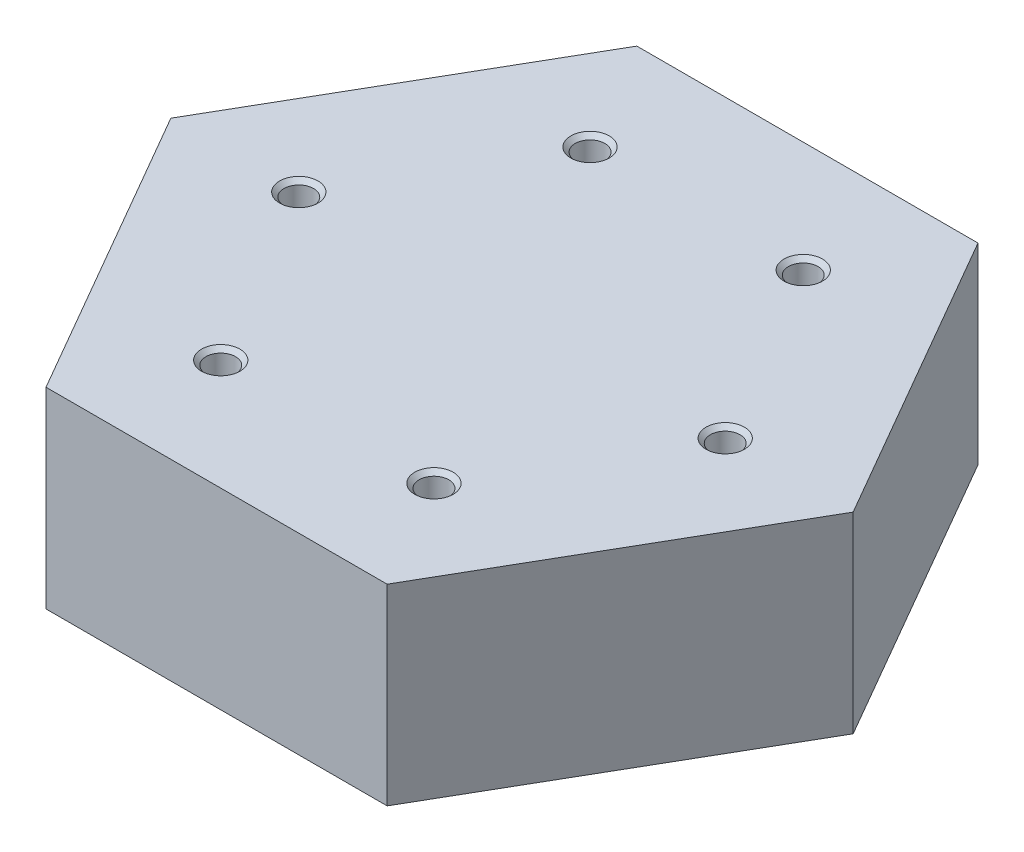
ISO-10303-21;
HEADER;
FILE_DESCRIPTION(('STEP AP214'),'2;1');
FILE_NAME('part.step','',(''),(''),'','','');
FILE_SCHEMA(('AUTOMOTIVE_DESIGN { 1 0 10303 214 1 1 1 1 }'));
ENDSEC;
DATA;
#1=APPLICATION_CONTEXT('core data for automotive mechanical design processes');
#2=APPLICATION_PROTOCOL_DEFINITION('international standard','automotive_design',2000,#1);
#3=PRODUCT_CONTEXT('',#1,'mechanical');
#4=PRODUCT('Part','Part','',(#3));
#5=PRODUCT_RELATED_PRODUCT_CATEGORY('part','',(#4));
#6=PRODUCT_DEFINITION_FORMATION('','',#4);
#7=PRODUCT_DEFINITION_CONTEXT('part definition',#1,'design');
#8=PRODUCT_DEFINITION('design','',#6,#7);
#9=PRODUCT_DEFINITION_SHAPE('','',#8);
#10=(LENGTH_UNIT() NAMED_UNIT(*) SI_UNIT(.MILLI.,.METRE.));
#11=(NAMED_UNIT(*) PLANE_ANGLE_UNIT() SI_UNIT($,.RADIAN.));
#12=(NAMED_UNIT(*) SI_UNIT($,.STERADIAN.) SOLID_ANGLE_UNIT());
#13=UNCERTAINTY_MEASURE_WITH_UNIT(LENGTH_MEASURE(1.E-05),#10,'distance_accuracy_value','');
#14=(GEOMETRIC_REPRESENTATION_CONTEXT(3) GLOBAL_UNCERTAINTY_ASSIGNED_CONTEXT((#13)) GLOBAL_UNIT_ASSIGNED_CONTEXT((#10,
#11,#12)) REPRESENTATION_CONTEXT('',''));
#15=CARTESIAN_POINT('',(0.,0.,0.));
#16=DIRECTION('',(0.,0.,1.));
#17=DIRECTION('',(1.,0.,0.));
#18=AXIS2_PLACEMENT_3D('',#15,#16,#17);
#19=CARTESIAN_POINT('',(29.3293936748329,16.51,50.8));
#20=DIRECTION('',(-0.866025403784438,0.,-0.500000000000001));
#21=DIRECTION('',(-0.500000000000001,0.,0.866025403784438));
#22=AXIS2_PLACEMENT_3D('',#19,#20,#21);
#23=PLANE('',#22);
#24=DIRECTION('',(0.500000000000001,0.,-0.866025403784438));
#25=VECTOR('',#24,1.);
#26=CARTESIAN_POINT('',(29.3293936748329,-16.51,50.8));
#27=LINE('',#26,#25);
#28=CARTESIAN_POINT('',(29.3293936748329,-16.51,50.8));
#29=VERTEX_POINT('',#28);
#30=CARTESIAN_POINT('',(58.658787349666,-16.51,0.));
#31=VERTEX_POINT('',#30);
#32=EDGE_CURVE('E128',#29,#31,#27,.T.);
#33=ORIENTED_EDGE('',*,*,#32,.T.);
#34=DIRECTION('',(0.,-1.,0.));
#35=VECTOR('',#34,1.);
#36=CARTESIAN_POINT('',(58.658787349666,16.51,0.));
#37=LINE('',#36,#35);
#38=CARTESIAN_POINT('',(58.658787349666,16.51,0.));
#39=VERTEX_POINT('',#38);
#40=EDGE_CURVE('E11',#39,#31,#37,.T.);
#41=ORIENTED_EDGE('',*,*,#40,.F.);
#42=DIRECTION('',(0.500000000000001,0.,-0.866025403784438));
#43=VECTOR('',#42,1.);
#44=CARTESIAN_POINT('',(29.3293936748329,16.51,50.8));
#45=LINE('',#44,#43);
#46=CARTESIAN_POINT('',(29.3293936748329,16.51,50.8));
#47=VERTEX_POINT('',#46);
#48=EDGE_CURVE('E139',#47,#39,#45,.T.);
#49=ORIENTED_EDGE('',*,*,#48,.F.);
#50=DIRECTION('',(0.,-1.,0.));
#51=VECTOR('',#50,1.);
#52=CARTESIAN_POINT('',(29.3293936748329,16.51,50.8));
#53=LINE('',#52,#51);
#54=EDGE_CURVE('E124',#47,#29,#53,.T.);
#55=ORIENTED_EDGE('',*,*,#54,.T.);
#56=EDGE_LOOP('',(#33,#41,#49,#55));
#57=FACE_BOUND('',#56,.T.);
#58=ADVANCED_FACE('F41',(#57),#23,.F.);
#59=CARTESIAN_POINT('',(58.658787349666,16.51,0.));
#60=DIRECTION('',(-0.866025403784439,0.,0.5));
#61=DIRECTION('',(0.5,0.,0.866025403784439));
#62=AXIS2_PLACEMENT_3D('',#59,#60,#61);
#63=PLANE('',#62);
#64=DIRECTION('',(-0.5,0.,-0.866025403784439));
#65=VECTOR('',#64,1.);
#66=CARTESIAN_POINT('',(58.658787349666,-16.51,0.));
#67=LINE('',#66,#65);
#68=CARTESIAN_POINT('',(29.329393674833,-16.51,-50.8));
#69=VERTEX_POINT('',#68);
#70=EDGE_CURVE('E131',#31,#69,#67,.T.);
#71=ORIENTED_EDGE('',*,*,#70,.T.);
#72=DIRECTION('',(0.,-1.,0.));
#73=VECTOR('',#72,1.);
#74=CARTESIAN_POINT('',(29.329393674833,16.51,-50.8));
#75=LINE('',#74,#73);
#76=CARTESIAN_POINT('',(29.329393674833,16.51,-50.8));
#77=VERTEX_POINT('',#76);
#78=EDGE_CURVE('E49',#77,#69,#75,.T.);
#79=ORIENTED_EDGE('',*,*,#78,.F.);
#80=DIRECTION('',(-0.5,0.,-0.866025403784439));
#81=VECTOR('',#80,1.);
#82=CARTESIAN_POINT('',(58.658787349666,16.51,0.));
#83=LINE('',#82,#81);
#84=EDGE_CURVE('E95',#39,#77,#83,.T.);
#85=ORIENTED_EDGE('',*,*,#84,.F.);
#86=ORIENTED_EDGE('',*,*,#40,.T.);
#87=EDGE_LOOP('',(#71,#79,#85,#86));
#88=FACE_BOUND('',#87,.T.);
#89=ADVANCED_FACE('F167',(#88),#63,.F.);
#90=CARTESIAN_POINT('',(29.329393674833,16.51,-50.8));
#91=DIRECTION('',(0.,0.,1.));
#92=DIRECTION('',(1.,0.,0.));
#93=AXIS2_PLACEMENT_3D('',#90,#91,#92);
#94=PLANE('',#93);
#95=DIRECTION('',(-1.,0.,0.));
#96=VECTOR('',#95,1.);
#97=CARTESIAN_POINT('',(29.329393674833,-16.51,-50.8));
#98=LINE('',#97,#96);
#99=CARTESIAN_POINT('',(-29.329393674833,-16.51,-50.8));
#100=VERTEX_POINT('',#99);
#101=EDGE_CURVE('E134',#69,#100,#98,.T.);
#102=ORIENTED_EDGE('',*,*,#101,.T.);
#103=DIRECTION('',(0.,-1.,0.));
#104=VECTOR('',#103,1.);
#105=CARTESIAN_POINT('',(-29.329393674833,16.51,-50.8));
#106=LINE('',#105,#104);
#107=CARTESIAN_POINT('',(-29.329393674833,16.51,-50.8));
#108=VERTEX_POINT('',#107);
#109=EDGE_CURVE('E119',#108,#100,#106,.T.);
#110=ORIENTED_EDGE('',*,*,#109,.F.);
#111=DIRECTION('',(-1.,0.,0.));
#112=VECTOR('',#111,1.);
#113=CARTESIAN_POINT('',(29.329393674833,16.51,-50.8));
#114=LINE('',#113,#112);
#115=EDGE_CURVE('E110',#77,#108,#114,.T.);
#116=ORIENTED_EDGE('',*,*,#115,.F.);
#117=ORIENTED_EDGE('',*,*,#78,.T.);
#118=EDGE_LOOP('',(#102,#110,#116,#117));
#119=FACE_BOUND('',#118,.T.);
#120=ADVANCED_FACE('F145',(#119),#94,.F.);
#121=CARTESIAN_POINT('',(-29.329393674833,16.51,-50.8));
#122=DIRECTION('',(0.866025403784439,0.,0.5));
#123=DIRECTION('',(0.5,0.,-0.866025403784439));
#124=AXIS2_PLACEMENT_3D('',#121,#122,#123);
#125=PLANE('',#124);
#126=CARTESIAN_POINT('',(-43.9940905122495,0.,-25.4));
#127=DIRECTION('',(-0.866025403784439,0.,-0.5));
#128=DIRECTION('',(-0.5,0.,0.866025403784439));
#129=AXIS2_PLACEMENT_3D('',#126,#127,#128);
#130=CIRCLE('',#129,3.302);
#131=CARTESIAN_POINT('',(-45.6450905122495,0.,-22.5403841167038));
#132=VERTEX_POINT('',#131);
#133=EDGE_CURVE('E183',#132,#132,#130,.T.);
#134=ORIENTED_EDGE('',*,*,#133,.F.);
#135=EDGE_LOOP('',(#134));
#136=FACE_BOUND('',#135,.T.);
#137=DIRECTION('',(-0.5,0.,0.866025403784439));
#138=VECTOR('',#137,1.);
#139=CARTESIAN_POINT('',(-29.329393674833,-16.51,-50.8));
#140=LINE('',#139,#138);
#141=CARTESIAN_POINT('',(-58.658787349666,-16.51,0.));
#142=VERTEX_POINT('',#141);
#143=EDGE_CURVE('E118',#100,#142,#140,.T.);
#144=ORIENTED_EDGE('',*,*,#143,.T.);
#145=DIRECTION('',(0.,-1.,0.));
#146=VECTOR('',#145,1.);
#147=CARTESIAN_POINT('',(-58.658787349666,16.51,0.));
#148=LINE('',#147,#146);
#149=CARTESIAN_POINT('',(-58.658787349666,16.51,0.));
#150=VERTEX_POINT('',#149);
#151=EDGE_CURVE('E115',#150,#142,#148,.T.);
#152=ORIENTED_EDGE('',*,*,#151,.F.);
#153=DIRECTION('',(-0.5,0.,0.866025403784439));
#154=VECTOR('',#153,1.);
#155=CARTESIAN_POINT('',(-29.329393674833,16.51,-50.8));
#156=LINE('',#155,#154);
#157=EDGE_CURVE('E104',#108,#150,#156,.T.);
#158=ORIENTED_EDGE('',*,*,#157,.F.);
#159=ORIENTED_EDGE('',*,*,#109,.T.);
#160=EDGE_LOOP('',(#144,#152,#158,#159));
#161=FACE_BOUND('',#160,.T.);
#162=ADVANCED_FACE('F116',(#136,#161),#125,.F.);
#163=CARTESIAN_POINT('',(-58.658787349666,16.51,0.));
#164=DIRECTION('',(0.866025403784439,0.,-0.5));
#165=DIRECTION('',(-0.5,0.,-0.866025403784439));
#166=AXIS2_PLACEMENT_3D('',#163,#164,#165);
#167=PLANE('',#166);
#168=CARTESIAN_POINT('',(-43.9940905122495,0.,25.4));
#169=DIRECTION('',(-0.866025403784439,0.,0.5));
#170=DIRECTION('',(0.5,0.,0.866025403784439));
#171=AXIS2_PLACEMENT_3D('',#168,#169,#170);
#172=CIRCLE('',#171,3.302);
#173=CARTESIAN_POINT('',(-42.3430905122495,0.,28.2596158832962));
#174=VERTEX_POINT('',#173);
#175=EDGE_CURVE('E193',#174,#174,#172,.T.);
#176=ORIENTED_EDGE('',*,*,#175,.F.);
#177=EDGE_LOOP('',(#176));
#178=FACE_BOUND('',#177,.T.);
#179=DIRECTION('',(0.5,0.,0.866025403784439));
#180=VECTOR('',#179,1.);
#181=CARTESIAN_POINT('',(-58.658787349666,-16.51,0.));
#182=LINE('',#181,#180);
#183=CARTESIAN_POINT('',(-29.329393674833,-16.51,50.8));
#184=VERTEX_POINT('',#183);
#185=EDGE_CURVE('E81',#142,#184,#182,.T.);
#186=ORIENTED_EDGE('',*,*,#185,.T.);
#187=DIRECTION('',(0.,-1.,0.));
#188=VECTOR('',#187,1.);
#189=CARTESIAN_POINT('',(-29.329393674833,16.51,50.8));
#190=LINE('',#189,#188);
#191=CARTESIAN_POINT('',(-29.329393674833,16.51,50.8));
#192=VERTEX_POINT('',#191);
#193=EDGE_CURVE('E120',#192,#184,#190,.T.);
#194=ORIENTED_EDGE('',*,*,#193,.F.);
#195=DIRECTION('',(0.5,0.,0.866025403784439));
#196=VECTOR('',#195,1.);
#197=CARTESIAN_POINT('',(-58.658787349666,16.51,0.));
#198=LINE('',#197,#196);
#199=EDGE_CURVE('E108',#150,#192,#198,.T.);
#200=ORIENTED_EDGE('',*,*,#199,.F.);
#201=ORIENTED_EDGE('',*,*,#151,.T.);
#202=EDGE_LOOP('',(#186,#194,#200,#201));
#203=FACE_BOUND('',#202,.T.);
#204=ADVANCED_FACE('F122',(#178,#203),#167,.F.);
#205=CARTESIAN_POINT('',(-29.329393674833,16.51,50.8));
#206=DIRECTION('',(0.,0.,-1.));
#207=DIRECTION('',(-1.,0.,0.));
#208=AXIS2_PLACEMENT_3D('',#205,#206,#207);
#209=PLANE('',#208);
#210=DIRECTION('',(1.,0.,0.));
#211=VECTOR('',#210,1.);
#212=CARTESIAN_POINT('',(-29.329393674833,-16.51,50.8));
#213=LINE('',#212,#211);
#214=EDGE_CURVE('E87',#184,#29,#213,.T.);
#215=ORIENTED_EDGE('',*,*,#214,.T.);
#216=ORIENTED_EDGE('',*,*,#54,.F.);
#217=DIRECTION('',(1.,0.,0.));
#218=VECTOR('',#217,1.);
#219=CARTESIAN_POINT('',(-29.329393674833,16.51,50.8));
#220=LINE('',#219,#218);
#221=EDGE_CURVE('E57',#192,#47,#220,.T.);
#222=ORIENTED_EDGE('',*,*,#221,.F.);
#223=ORIENTED_EDGE('',*,*,#193,.T.);
#224=EDGE_LOOP('',(#215,#216,#222,#223));
#225=FACE_BOUND('',#224,.T.);
#226=ADVANCED_FACE('F152',(#225),#209,.F.);
#227=CARTESIAN_POINT('',(0.,16.51,0.));
#228=DIRECTION('',(0.,1.,0.));
#229=DIRECTION('',(0.,0.,1.));
#230=AXIS2_PLACEMENT_3D('',#227,#228,#229);
#231=PLANE('',#230);
#232=CARTESIAN_POINT('',(18.3308710467706,16.51,31.75));
#233=DIRECTION('',(0.,1.,0.));
#234=DIRECTION('',(0.,0.,1.));
#235=AXIS2_PLACEMENT_3D('',#232,#233,#234);
#236=CIRCLE('',#235,3.302);
#237=CARTESIAN_POINT('',(18.3308710467706,16.51,35.052));
#238=VERTEX_POINT('',#237);
#239=EDGE_CURVE('E202',#238,#238,#236,.T.);
#240=ORIENTED_EDGE('',*,*,#239,.F.);
#241=EDGE_LOOP('',(#240));
#242=FACE_BOUND('',#241,.T.);
#243=CARTESIAN_POINT('',(36.6617420935412,16.51,0.));
#244=DIRECTION('',(0.,1.,0.));
#245=DIRECTION('',(0.,0.,1.));
#246=AXIS2_PLACEMENT_3D('',#243,#244,#245);
#247=CIRCLE('',#246,3.302);
#248=CARTESIAN_POINT('',(36.6617420935412,16.51,3.302));
#249=VERTEX_POINT('',#248);
#250=EDGE_CURVE('E211',#249,#249,#247,.T.);
#251=ORIENTED_EDGE('',*,*,#250,.F.);
#252=EDGE_LOOP('',(#251));
#253=FACE_BOUND('',#252,.T.);
#254=CARTESIAN_POINT('',(-18.3308710467706,16.51,-31.75));
#255=DIRECTION('',(0.,1.,0.));
#256=DIRECTION('',(0.,0.,1.));
#257=AXIS2_PLACEMENT_3D('',#254,#255,#256);
#258=CIRCLE('',#257,3.302);
#259=CARTESIAN_POINT('',(-18.3308710467706,16.51,-28.448));
#260=VERTEX_POINT('',#259);
#261=EDGE_CURVE('E220',#260,#260,#258,.T.);
#262=ORIENTED_EDGE('',*,*,#261,.F.);
#263=EDGE_LOOP('',(#262));
#264=FACE_BOUND('',#263,.T.);
#265=CARTESIAN_POINT('',(-36.6617420935412,16.51,0.));
#266=DIRECTION('',(0.,1.,0.));
#267=DIRECTION('',(0.,0.,1.));
#268=AXIS2_PLACEMENT_3D('',#265,#266,#267);
#269=CIRCLE('',#268,3.302);
#270=CARTESIAN_POINT('',(-36.6617420935412,16.51,3.30199999999999));
#271=VERTEX_POINT('',#270);
#272=EDGE_CURVE('E229',#271,#271,#269,.T.);
#273=ORIENTED_EDGE('',*,*,#272,.F.);
#274=EDGE_LOOP('',(#273));
#275=FACE_BOUND('',#274,.T.);
#276=CARTESIAN_POINT('',(-18.3308710467706,16.51,31.75));
#277=DIRECTION('',(0.,1.,0.));
#278=DIRECTION('',(0.,0.,1.));
#279=AXIS2_PLACEMENT_3D('',#276,#277,#278);
#280=CIRCLE('',#279,3.302);
#281=CARTESIAN_POINT('',(-18.3308710467706,16.51,35.052));
#282=VERTEX_POINT('',#281);
#283=EDGE_CURVE('E238',#282,#282,#280,.T.);
#284=ORIENTED_EDGE('',*,*,#283,.F.);
#285=EDGE_LOOP('',(#284));
#286=FACE_BOUND('',#285,.T.);
#287=CARTESIAN_POINT('',(18.3308710467706,16.51,-31.75));
#288=DIRECTION('',(0.,1.,0.));
#289=DIRECTION('',(0.,0.,1.));
#290=AXIS2_PLACEMENT_3D('',#287,#288,#289);
#291=CIRCLE('',#290,3.302);
#292=CARTESIAN_POINT('',(18.3308710467706,16.51,-28.448));
#293=VERTEX_POINT('',#292);
#294=EDGE_CURVE('E247',#293,#293,#291,.T.);
#295=ORIENTED_EDGE('',*,*,#294,.F.);
#296=EDGE_LOOP('',(#295));
#297=FACE_BOUND('',#296,.T.);
#298=ORIENTED_EDGE('',*,*,#48,.T.);
#299=ORIENTED_EDGE('',*,*,#84,.T.);
#300=ORIENTED_EDGE('',*,*,#115,.T.);
#301=ORIENTED_EDGE('',*,*,#157,.T.);
#302=ORIENTED_EDGE('',*,*,#199,.T.);
#303=ORIENTED_EDGE('',*,*,#221,.T.);
#304=EDGE_LOOP('',(#298,#299,#300,#301,#302,#303));
#305=FACE_BOUND('',#304,.T.);
#306=ADVANCED_FACE('F106',(#242,#253,#264,#275,#286,#297,#305),#231,.T.);
#307=CARTESIAN_POINT('',(0.,-16.51,0.));
#308=DIRECTION('',(0.,1.,0.));
#309=DIRECTION('',(0.,0.,1.));
#310=AXIS2_PLACEMENT_3D('',#307,#308,#309);
#311=PLANE('',#310);
#312=ORIENTED_EDGE('',*,*,#32,.F.);
#313=ORIENTED_EDGE('',*,*,#214,.F.);
#314=ORIENTED_EDGE('',*,*,#185,.F.);
#315=ORIENTED_EDGE('',*,*,#143,.F.);
#316=ORIENTED_EDGE('',*,*,#101,.F.);
#317=ORIENTED_EDGE('',*,*,#70,.F.);
#318=EDGE_LOOP('',(#312,#313,#314,#315,#316,#317));
#319=FACE_BOUND('',#318,.T.);
#320=ADVANCED_FACE('F148',(#319),#311,.F.);
#321=CARTESIAN_POINT('',(18.3308710467706,-2.54,-31.75));
#322=DIRECTION('',(0.,1.,0.));
#323=DIRECTION('',(0.,0.,1.));
#324=AXIS2_PLACEMENT_3D('',#321,#322,#323);
#325=CONICAL_SURFACE('',#324,2.5527,1.02974425867665);
#326=CARTESIAN_POINT('',(18.3308710467706,-4.07381690219165,-31.75));
#327=VERTEX_POINT('',#326);
#328=VERTEX_LOOP('',#327);
#329=FACE_BOUND('',#328,.T.);
#330=CARTESIAN_POINT('',(18.3308710467706,-2.54,-31.75));
#331=DIRECTION('',(0.,1.,0.));
#332=DIRECTION('',(0.,0.,1.));
#333=AXIS2_PLACEMENT_3D('',#330,#331,#332);
#334=CIRCLE('',#333,2.5527);
#335=CARTESIAN_POINT('',(18.3308710467706,-2.54,-29.1973));
#336=VERTEX_POINT('',#335);
#337=EDGE_CURVE('E132',#336,#336,#334,.T.);
#338=ORIENTED_EDGE('',*,*,#337,.T.);
#339=EDGE_LOOP('',(#338));
#340=FACE_BOUND('',#339,.T.);
#341=ADVANCED_FACE('F258',(#329,#340),#325,.F.);
#342=CARTESIAN_POINT('',(18.3308710467706,16.51,-31.75));
#343=DIRECTION('',(0.,1.,0.));
#344=DIRECTION('',(0.,0.,1.));
#345=AXIS2_PLACEMENT_3D('',#342,#343,#344);
#346=CYLINDRICAL_SURFACE('',#345,2.5527);
#347=ORIENTED_EDGE('',*,*,#337,.F.);
#348=EDGE_LOOP('',(#347));
#349=FACE_BOUND('',#348,.T.);
#350=CARTESIAN_POINT('',(18.3308710467706,15.7607,-31.75));
#351=DIRECTION('',(0.,1.,0.));
#352=DIRECTION('',(0.,0.,1.));
#353=AXIS2_PLACEMENT_3D('',#350,#351,#352);
#354=CIRCLE('',#353,2.5527);
#355=CARTESIAN_POINT('',(18.3308710467706,15.7607,-29.1973));
#356=VERTEX_POINT('',#355);
#357=EDGE_CURVE('E250',#356,#356,#354,.T.);
#358=ORIENTED_EDGE('',*,*,#357,.T.);
#359=EDGE_LOOP('',(#358));
#360=FACE_BOUND('',#359,.T.);
#361=ADVANCED_FACE('F260',(#349,#360),#346,.F.);
#362=CARTESIAN_POINT('',(18.3308710467706,16.51,-31.75));
#363=DIRECTION('',(0.,1.,0.));
#364=DIRECTION('',(0.,0.,1.));
#365=AXIS2_PLACEMENT_3D('',#362,#363,#364);
#366=CONICAL_SURFACE('',#365,3.302,0.785398163397448);
#367=ORIENTED_EDGE('',*,*,#357,.F.);
#368=EDGE_LOOP('',(#367));
#369=FACE_BOUND('',#368,.T.);
#370=ORIENTED_EDGE('',*,*,#294,.T.);
#371=EDGE_LOOP('',(#370));
#372=FACE_BOUND('',#371,.T.);
#373=ADVANCED_FACE('F263',(#369,#372),#366,.F.);
#374=CARTESIAN_POINT('',(-18.3308710467706,-2.54,31.75));
#375=DIRECTION('',(0.,1.,0.));
#376=DIRECTION('',(0.,0.,1.));
#377=AXIS2_PLACEMENT_3D('',#374,#375,#376);
#378=CONICAL_SURFACE('',#377,2.55269999999999,1.02974425867665);
#379=CARTESIAN_POINT('',(-18.3308710467706,-4.07381690219165,31.75));
#380=VERTEX_POINT('',#379);
#381=VERTEX_LOOP('',#380);
#382=FACE_BOUND('',#381,.T.);
#383=CARTESIAN_POINT('',(-18.3308710467706,-2.54,31.75));
#384=DIRECTION('',(0.,1.,0.));
#385=DIRECTION('',(0.,0.,1.));
#386=AXIS2_PLACEMENT_3D('',#383,#384,#385);
#387=CIRCLE('',#386,2.55269999999999);
#388=CARTESIAN_POINT('',(-18.3308710467706,-2.54,34.3027));
#389=VERTEX_POINT('',#388);
#390=EDGE_CURVE('E244',#389,#389,#387,.T.);
#391=ORIENTED_EDGE('',*,*,#390,.T.);
#392=EDGE_LOOP('',(#391));
#393=FACE_BOUND('',#392,.T.);
#394=ADVANCED_FACE('F269',(#382,#393),#378,.F.);
#395=CARTESIAN_POINT('',(-18.3308710467706,16.51,31.75));
#396=DIRECTION('',(0.,1.,0.));
#397=DIRECTION('',(0.,0.,1.));
#398=AXIS2_PLACEMENT_3D('',#395,#396,#397);
#399=CYLINDRICAL_SURFACE('',#398,2.5527);
#400=ORIENTED_EDGE('',*,*,#390,.F.);
#401=EDGE_LOOP('',(#400));
#402=FACE_BOUND('',#401,.T.);
#403=CARTESIAN_POINT('',(-18.3308710467706,15.7607,31.75));
#404=DIRECTION('',(0.,1.,0.));
#405=DIRECTION('',(0.,0.,1.));
#406=AXIS2_PLACEMENT_3D('',#403,#404,#405);
#407=CIRCLE('',#406,2.5527);
#408=CARTESIAN_POINT('',(-18.3308710467706,15.7607,34.3027));
#409=VERTEX_POINT('',#408);
#410=EDGE_CURVE('E241',#409,#409,#407,.T.);
#411=ORIENTED_EDGE('',*,*,#410,.T.);
#412=EDGE_LOOP('',(#411));
#413=FACE_BOUND('',#412,.T.);
#414=ADVANCED_FACE('F276',(#402,#413),#399,.F.);
#415=CARTESIAN_POINT('',(-18.3308710467706,16.51,31.75));
#416=DIRECTION('',(0.,1.,0.));
#417=DIRECTION('',(0.,0.,1.));
#418=AXIS2_PLACEMENT_3D('',#415,#416,#417);
#419=CONICAL_SURFACE('',#418,3.302,0.785398163397448);
#420=ORIENTED_EDGE('',*,*,#410,.F.);
#421=EDGE_LOOP('',(#420));
#422=FACE_BOUND('',#421,.T.);
#423=ORIENTED_EDGE('',*,*,#283,.T.);
#424=EDGE_LOOP('',(#423));
#425=FACE_BOUND('',#424,.T.);
#426=ADVANCED_FACE('F310',(#422,#425),#419,.F.);
#427=CARTESIAN_POINT('',(-36.6617420935412,-2.54,0.));
#428=DIRECTION('',(0.,1.,0.));
#429=DIRECTION('',(0.,0.,1.));
#430=AXIS2_PLACEMENT_3D('',#427,#428,#429);
#431=CONICAL_SURFACE('',#430,2.5527,1.02974425867665);
#432=CARTESIAN_POINT('',(-36.6617420935412,-4.07381690219165,0.));
#433=VERTEX_POINT('',#432);
#434=VERTEX_LOOP('',#433);
#435=FACE_BOUND('',#434,.T.);
#436=CARTESIAN_POINT('',(-36.6617420935412,-2.54,0.));
#437=DIRECTION('',(0.,1.,0.));
#438=DIRECTION('',(0.,0.,1.));
#439=AXIS2_PLACEMENT_3D('',#436,#437,#438);
#440=CIRCLE('',#439,2.5527);
#441=CARTESIAN_POINT('',(-36.6617420935412,-2.54,2.55269999999999));
#442=VERTEX_POINT('',#441);
#443=EDGE_CURVE('E235',#442,#442,#440,.T.);
#444=ORIENTED_EDGE('',*,*,#443,.T.);
#445=EDGE_LOOP('',(#444));
#446=FACE_BOUND('',#445,.T.);
#447=ADVANCED_FACE('F322',(#435,#446),#431,.F.);
#448=CARTESIAN_POINT('',(-36.6617420935412,16.51,0.));
#449=DIRECTION('',(0.,1.,0.));
#450=DIRECTION('',(0.,0.,1.));
#451=AXIS2_PLACEMENT_3D('',#448,#449,#450);
#452=CYLINDRICAL_SURFACE('',#451,2.5527);
#453=ORIENTED_EDGE('',*,*,#443,.F.);
#454=EDGE_LOOP('',(#453));
#455=FACE_BOUND('',#454,.T.);
#456=CARTESIAN_POINT('',(-36.6617420935412,15.7607,0.));
#457=DIRECTION('',(0.,1.,0.));
#458=DIRECTION('',(0.,0.,1.));
#459=AXIS2_PLACEMENT_3D('',#456,#457,#458);
#460=CIRCLE('',#459,2.5527);
#461=CARTESIAN_POINT('',(-36.6617420935412,15.7607,2.55269999999999));
#462=VERTEX_POINT('',#461);
#463=EDGE_CURVE('E232',#462,#462,#460,.T.);
#464=ORIENTED_EDGE('',*,*,#463,.T.);
#465=EDGE_LOOP('',(#464));
#466=FACE_BOUND('',#465,.T.);
#467=ADVANCED_FACE('F317',(#455,#466),#452,.F.);
#468=CARTESIAN_POINT('',(-36.6617420935412,16.51,0.));
#469=DIRECTION('',(0.,1.,0.));
#470=DIRECTION('',(0.,0.,1.));
#471=AXIS2_PLACEMENT_3D('',#468,#469,#470);
#472=CONICAL_SURFACE('',#471,3.302,0.785398163397448);
#473=ORIENTED_EDGE('',*,*,#463,.F.);
#474=EDGE_LOOP('',(#473));
#475=FACE_BOUND('',#474,.T.);
#476=ORIENTED_EDGE('',*,*,#272,.T.);
#477=EDGE_LOOP('',(#476));
#478=FACE_BOUND('',#477,.T.);
#479=ADVANCED_FACE('F321',(#475,#478),#472,.F.);
#480=CARTESIAN_POINT('',(-18.3308710467706,-2.54,-31.75));
#481=DIRECTION('',(0.,1.,0.));
#482=DIRECTION('',(0.,0.,1.));
#483=AXIS2_PLACEMENT_3D('',#480,#481,#482);
#484=CONICAL_SURFACE('',#483,2.55269999999999,1.02974425867665);
#485=CARTESIAN_POINT('',(-18.3308710467706,-4.07381690219165,-31.75));
#486=VERTEX_POINT('',#485);
#487=VERTEX_LOOP('',#486);
#488=FACE_BOUND('',#487,.T.);
#489=CARTESIAN_POINT('',(-18.3308710467706,-2.54,-31.75));
#490=DIRECTION('',(0.,1.,0.));
#491=DIRECTION('',(0.,0.,1.));
#492=AXIS2_PLACEMENT_3D('',#489,#490,#491);
#493=CIRCLE('',#492,2.55269999999999);
#494=CARTESIAN_POINT('',(-18.3308710467706,-2.54,-29.1973));
#495=VERTEX_POINT('',#494);
#496=EDGE_CURVE('E226',#495,#495,#493,.T.);
#497=ORIENTED_EDGE('',*,*,#496,.T.);
#498=EDGE_LOOP('',(#497));
#499=FACE_BOUND('',#498,.T.);
#500=ADVANCED_FACE('F336',(#488,#499),#484,.F.);
#501=CARTESIAN_POINT('',(-18.3308710467706,16.51,-31.75));
#502=DIRECTION('',(0.,1.,0.));
#503=DIRECTION('',(0.,0.,1.));
#504=AXIS2_PLACEMENT_3D('',#501,#502,#503);
#505=CYLINDRICAL_SURFACE('',#504,2.5527);
#506=ORIENTED_EDGE('',*,*,#496,.F.);
#507=EDGE_LOOP('',(#506));
#508=FACE_BOUND('',#507,.T.);
#509=CARTESIAN_POINT('',(-18.3308710467706,15.7607,-31.75));
#510=DIRECTION('',(0.,1.,0.));
#511=DIRECTION('',(0.,0.,1.));
#512=AXIS2_PLACEMENT_3D('',#509,#510,#511);
#513=CIRCLE('',#512,2.5527);
#514=CARTESIAN_POINT('',(-18.3308710467706,15.7607,-29.1973));
#515=VERTEX_POINT('',#514);
#516=EDGE_CURVE('E223',#515,#515,#513,.T.);
#517=ORIENTED_EDGE('',*,*,#516,.T.);
#518=EDGE_LOOP('',(#517));
#519=FACE_BOUND('',#518,.T.);
#520=ADVANCED_FACE('F331',(#508,#519),#505,.F.);
#521=CARTESIAN_POINT('',(-18.3308710467706,16.51,-31.75));
#522=DIRECTION('',(0.,1.,0.));
#523=DIRECTION('',(0.,0.,1.));
#524=AXIS2_PLACEMENT_3D('',#521,#522,#523);
#525=CONICAL_SURFACE('',#524,3.302,0.785398163397448);
#526=ORIENTED_EDGE('',*,*,#516,.F.);
#527=EDGE_LOOP('',(#526));
#528=FACE_BOUND('',#527,.T.);
#529=ORIENTED_EDGE('',*,*,#261,.T.);
#530=EDGE_LOOP('',(#529));
#531=FACE_BOUND('',#530,.T.);
#532=ADVANCED_FACE('F335',(#528,#531),#525,.F.);
#533=CARTESIAN_POINT('',(36.6617420935412,-2.54,0.));
#534=DIRECTION('',(0.,1.,0.));
#535=DIRECTION('',(0.,0.,1.));
#536=AXIS2_PLACEMENT_3D('',#533,#534,#535);
#537=CONICAL_SURFACE('',#536,2.5527,1.02974425867665);
#538=CARTESIAN_POINT('',(36.6617420935412,-4.07381690219165,0.));
#539=VERTEX_POINT('',#538);
#540=VERTEX_LOOP('',#539);
#541=FACE_BOUND('',#540,.T.);
#542=CARTESIAN_POINT('',(36.6617420935412,-2.54,0.));
#543=DIRECTION('',(0.,1.,0.));
#544=DIRECTION('',(0.,0.,1.));
#545=AXIS2_PLACEMENT_3D('',#542,#543,#544);
#546=CIRCLE('',#545,2.5527);
#547=CARTESIAN_POINT('',(36.6617420935412,-2.54,2.5527));
#548=VERTEX_POINT('',#547);
#549=EDGE_CURVE('E217',#548,#548,#546,.T.);
#550=ORIENTED_EDGE('',*,*,#549,.T.);
#551=EDGE_LOOP('',(#550));
#552=FACE_BOUND('',#551,.T.);
#553=ADVANCED_FACE('F350',(#541,#552),#537,.F.);
#554=CARTESIAN_POINT('',(36.6617420935412,16.51,0.));
#555=DIRECTION('',(0.,1.,0.));
#556=DIRECTION('',(0.,0.,1.));
#557=AXIS2_PLACEMENT_3D('',#554,#555,#556);
#558=CYLINDRICAL_SURFACE('',#557,2.5527);
#559=ORIENTED_EDGE('',*,*,#549,.F.);
#560=EDGE_LOOP('',(#559));
#561=FACE_BOUND('',#560,.T.);
#562=CARTESIAN_POINT('',(36.6617420935412,15.7607,0.));
#563=DIRECTION('',(0.,1.,0.));
#564=DIRECTION('',(0.,0.,1.));
#565=AXIS2_PLACEMENT_3D('',#562,#563,#564);
#566=CIRCLE('',#565,2.5527);
#567=CARTESIAN_POINT('',(36.6617420935412,15.7607,2.5527));
#568=VERTEX_POINT('',#567);
#569=EDGE_CURVE('E214',#568,#568,#566,.T.);
#570=ORIENTED_EDGE('',*,*,#569,.T.);
#571=EDGE_LOOP('',(#570));
#572=FACE_BOUND('',#571,.T.);
#573=ADVANCED_FACE('F345',(#561,#572),#558,.F.);
#574=CARTESIAN_POINT('',(36.6617420935412,16.51,0.));
#575=DIRECTION('',(0.,1.,0.));
#576=DIRECTION('',(0.,0.,1.));
#577=AXIS2_PLACEMENT_3D('',#574,#575,#576);
#578=CONICAL_SURFACE('',#577,3.302,0.785398163397448);
#579=ORIENTED_EDGE('',*,*,#569,.F.);
#580=EDGE_LOOP('',(#579));
#581=FACE_BOUND('',#580,.T.);
#582=ORIENTED_EDGE('',*,*,#250,.T.);
#583=EDGE_LOOP('',(#582));
#584=FACE_BOUND('',#583,.T.);
#585=ADVANCED_FACE('F349',(#581,#584),#578,.F.);
#586=CARTESIAN_POINT('',(18.3308710467706,-2.54,31.75));
#587=DIRECTION('',(0.,1.,0.));
#588=DIRECTION('',(0.,0.,1.));
#589=AXIS2_PLACEMENT_3D('',#586,#587,#588);
#590=CONICAL_SURFACE('',#589,2.5527,1.02974425867665);
#591=CARTESIAN_POINT('',(18.3308710467706,-4.07381690219165,31.75));
#592=VERTEX_POINT('',#591);
#593=VERTEX_LOOP('',#592);
#594=FACE_BOUND('',#593,.T.);
#595=CARTESIAN_POINT('',(18.3308710467706,-2.54,31.75));
#596=DIRECTION('',(0.,1.,0.));
#597=DIRECTION('',(0.,0.,1.));
#598=AXIS2_PLACEMENT_3D('',#595,#596,#597);
#599=CIRCLE('',#598,2.5527);
#600=CARTESIAN_POINT('',(18.3308710467706,-2.54,34.3027));
#601=VERTEX_POINT('',#600);
#602=EDGE_CURVE('E208',#601,#601,#599,.T.);
#603=ORIENTED_EDGE('',*,*,#602,.T.);
#604=EDGE_LOOP('',(#603));
#605=FACE_BOUND('',#604,.T.);
#606=ADVANCED_FACE('F363',(#594,#605),#590,.F.);
#607=CARTESIAN_POINT('',(18.3308710467706,16.51,31.75));
#608=DIRECTION('',(0.,1.,0.));
#609=DIRECTION('',(0.,0.,1.));
#610=AXIS2_PLACEMENT_3D('',#607,#608,#609);
#611=CYLINDRICAL_SURFACE('',#610,2.5527);
#612=ORIENTED_EDGE('',*,*,#602,.F.);
#613=EDGE_LOOP('',(#612));
#614=FACE_BOUND('',#613,.T.);
#615=CARTESIAN_POINT('',(18.3308710467706,15.7607,31.75));
#616=DIRECTION('',(0.,1.,0.));
#617=DIRECTION('',(0.,0.,1.));
#618=AXIS2_PLACEMENT_3D('',#615,#616,#617);
#619=CIRCLE('',#618,2.5527);
#620=CARTESIAN_POINT('',(18.3308710467706,15.7607,34.3027));
#621=VERTEX_POINT('',#620);
#622=EDGE_CURVE('E205',#621,#621,#619,.T.);
#623=ORIENTED_EDGE('',*,*,#622,.T.);
#624=EDGE_LOOP('',(#623));
#625=FACE_BOUND('',#624,.T.);
#626=ADVANCED_FACE('F359',(#614,#625),#611,.F.);
#627=CARTESIAN_POINT('',(18.3308710467706,16.51,31.75));
#628=DIRECTION('',(0.,1.,0.));
#629=DIRECTION('',(0.,0.,1.));
#630=AXIS2_PLACEMENT_3D('',#627,#628,#629);
#631=CONICAL_SURFACE('',#630,3.302,0.785398163397448);
#632=ORIENTED_EDGE('',*,*,#622,.F.);
#633=EDGE_LOOP('',(#632));
#634=FACE_BOUND('',#633,.T.);
#635=ORIENTED_EDGE('',*,*,#239,.T.);
#636=EDGE_LOOP('',(#635));
#637=FACE_BOUND('',#636,.T.);
#638=ADVANCED_FACE('F362',(#634,#637),#631,.F.);
#639=CARTESIAN_POINT('',(-27.4963065701559,0.,15.875));
#640=DIRECTION('',(-0.866025403784439,0.,0.5));
#641=DIRECTION('',(0.5,0.,0.866025403784439));
#642=AXIS2_PLACEMENT_3D('',#639,#640,#641);
#643=CONICAL_SURFACE('',#642,2.5527,1.02974425867665);
#644=CARTESIAN_POINT('',(-26.167982168104,0.,15.1080915489042));
#645=VERTEX_POINT('',#644);
#646=VERTEX_LOOP('',#645);
#647=FACE_BOUND('',#646,.T.);
#648=CARTESIAN_POINT('',(-27.4963065701559,0.,15.875));
#649=DIRECTION('',(-0.866025403784439,0.,0.5));
#650=DIRECTION('',(0.5,0.,0.866025403784439));
#651=AXIS2_PLACEMENT_3D('',#648,#649,#650);
#652=CIRCLE('',#651,2.5527);
#653=CARTESIAN_POINT('',(-26.2199565701559,0.,18.0857030482405));
#654=VERTEX_POINT('',#653);
#655=EDGE_CURVE('E199',#654,#654,#652,.T.);
#656=ORIENTED_EDGE('',*,*,#655,.T.);
#657=EDGE_LOOP('',(#656));
#658=FACE_BOUND('',#657,.T.);
#659=ADVANCED_FACE('F376',(#647,#658),#643,.F.);
#660=CARTESIAN_POINT('',(-43.9940905122495,0.,25.4));
#661=DIRECTION('',(-0.866025403784439,0.,0.5));
#662=DIRECTION('',(0.5,0.,0.866025403784439));
#663=AXIS2_PLACEMENT_3D('',#660,#661,#662);
#664=CYLINDRICAL_SURFACE('',#663,2.5527);
#665=ORIENTED_EDGE('',*,*,#655,.F.);
#666=EDGE_LOOP('',(#665));
#667=FACE_BOUND('',#666,.T.);
#668=CARTESIAN_POINT('',(-43.3451776771938,0.,25.02535));
#669=DIRECTION('',(-0.866025403784439,0.,0.5));
#670=DIRECTION('',(0.5,0.,0.866025403784439));
#671=AXIS2_PLACEMENT_3D('',#668,#669,#670);
#672=CIRCLE('',#671,2.5527);
#673=CARTESIAN_POINT('',(-42.0688276771938,0.,27.2360530482405));
#674=VERTEX_POINT('',#673);
#675=EDGE_CURVE('E196',#674,#674,#672,.T.);
#676=ORIENTED_EDGE('',*,*,#675,.T.);
#677=EDGE_LOOP('',(#676));
#678=FACE_BOUND('',#677,.T.);
#679=ADVANCED_FACE('F302',(#667,#678),#664,.F.);
#680=CARTESIAN_POINT('',(-43.9940905122495,0.,25.4));
#681=DIRECTION('',(-0.866025403784439,0.,0.5));
#682=DIRECTION('',(0.5,0.,0.866025403784439));
#683=AXIS2_PLACEMENT_3D('',#680,#681,#682);
#684=CONICAL_SURFACE('',#683,3.302,0.78539816339745);
#685=ORIENTED_EDGE('',*,*,#675,.F.);
#686=EDGE_LOOP('',(#685));
#687=FACE_BOUND('',#686,.T.);
#688=ORIENTED_EDGE('',*,*,#175,.T.);
#689=EDGE_LOOP('',(#688));
#690=FACE_BOUND('',#689,.T.);
#691=ADVANCED_FACE('F390',(#687,#690),#684,.F.);
#692=CARTESIAN_POINT('',(-27.4963065701559,0.,-15.875));
#693=DIRECTION('',(-0.866025403784439,0.,-0.5));
#694=DIRECTION('',(-0.5,0.,0.866025403784439));
#695=AXIS2_PLACEMENT_3D('',#692,#693,#694);
#696=CONICAL_SURFACE('',#695,2.5527,1.02974425867665);
#697=CARTESIAN_POINT('',(-26.167982168104,0.,-15.1080915489042));
#698=VERTEX_POINT('',#697);
#699=VERTEX_LOOP('',#698);
#700=FACE_BOUND('',#699,.T.);
#701=CARTESIAN_POINT('',(-27.4963065701559,0.,-15.875));
#702=DIRECTION('',(-0.866025403784439,0.,-0.5));
#703=DIRECTION('',(-0.5,0.,0.866025403784439));
#704=AXIS2_PLACEMENT_3D('',#701,#702,#703);
#705=CIRCLE('',#704,2.5527);
#706=CARTESIAN_POINT('',(-28.7726565701559,0.,-13.6642969517595));
#707=VERTEX_POINT('',#706);
#708=EDGE_CURVE('E188',#707,#707,#705,.T.);
#709=ORIENTED_EDGE('',*,*,#708,.T.);
#710=EDGE_LOOP('',(#709));
#711=FACE_BOUND('',#710,.T.);
#712=ADVANCED_FACE('F398',(#700,#711),#696,.F.);
#713=CARTESIAN_POINT('',(-43.9940905122495,0.,-25.4));
#714=DIRECTION('',(-0.866025403784439,0.,-0.5));
#715=DIRECTION('',(-0.5,0.,0.866025403784439));
#716=AXIS2_PLACEMENT_3D('',#713,#714,#715);
#717=CYLINDRICAL_SURFACE('',#716,2.5527);
#718=ORIENTED_EDGE('',*,*,#708,.F.);
#719=EDGE_LOOP('',(#718));
#720=FACE_BOUND('',#719,.T.);
#721=CARTESIAN_POINT('',(-43.3451776771938,0.,-25.02535));
#722=DIRECTION('',(-0.866025403784439,0.,-0.5));
#723=DIRECTION('',(-0.5,0.,0.866025403784439));
#724=AXIS2_PLACEMENT_3D('',#721,#722,#723);
#725=CIRCLE('',#724,2.5527);
#726=CARTESIAN_POINT('',(-44.6215276771938,0.,-22.8146469517595));
#727=VERTEX_POINT('',#726);
#728=EDGE_CURVE('E185',#727,#727,#725,.T.);
#729=ORIENTED_EDGE('',*,*,#728,.T.);
#730=EDGE_LOOP('',(#729));
#731=FACE_BOUND('',#730,.T.);
#732=ADVANCED_FACE('F406',(#720,#731),#717,.F.);
#733=CARTESIAN_POINT('',(-43.9940905122495,0.,-25.4));
#734=DIRECTION('',(-0.866025403784439,0.,-0.5));
#735=DIRECTION('',(-0.5,0.,0.866025403784439));
#736=AXIS2_PLACEMENT_3D('',#733,#734,#735);
#737=CONICAL_SURFACE('',#736,3.302,0.78539816339745);
#738=ORIENTED_EDGE('',*,*,#728,.F.);
#739=EDGE_LOOP('',(#738));
#740=FACE_BOUND('',#739,.T.);
#741=ORIENTED_EDGE('',*,*,#133,.T.);
#742=EDGE_LOOP('',(#741));
#743=FACE_BOUND('',#742,.T.);
#744=ADVANCED_FACE('F414',(#740,#743),#737,.F.);
#745=CLOSED_SHELL('',(#58,#89,#120,#162,#204,#226,#306,#320,#341,#361,#373,#394,#414,#426,#447,
#467,#479,#500,#520,#532,#553,#573,#585,#606,#626,#638,#659,#679,#691,#712,#732,#744));
#746=MANIFOLD_SOLID_BREP('B2',#745);
#747=ADVANCED_BREP_SHAPE_REPRESENTATION('',(#18,#746),#14);
#748=SHAPE_DEFINITION_REPRESENTATION(#9,#747);
ENDSEC;
END-ISO-10303-21;
